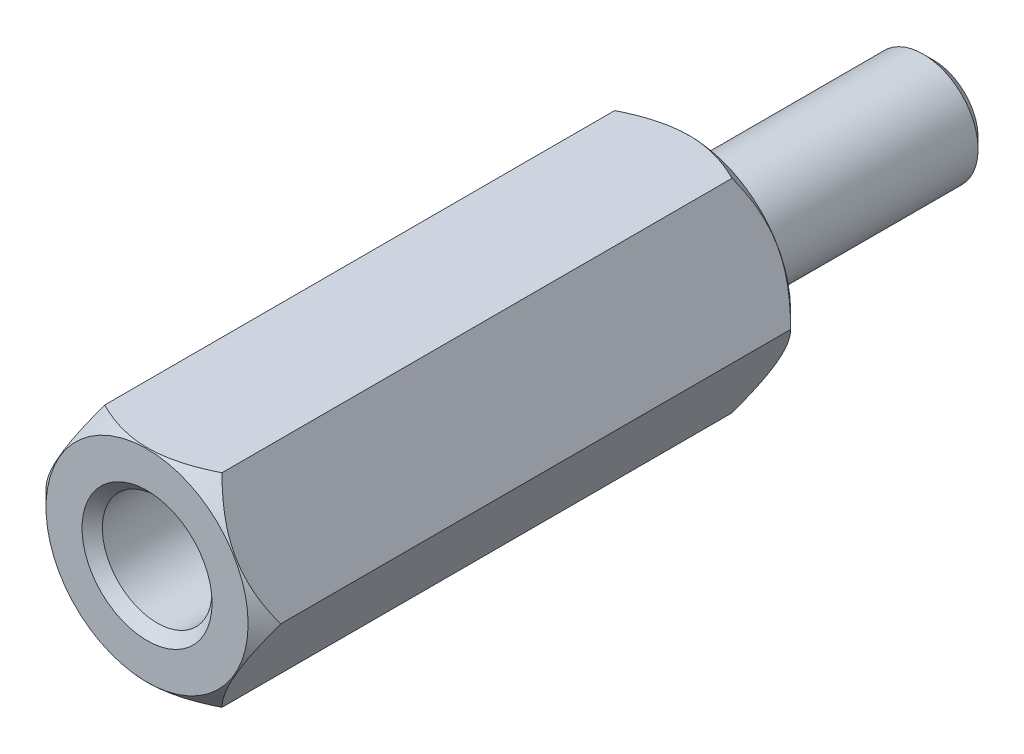
ISO-10303-21;
HEADER;
FILE_DESCRIPTION(('STEP AP214'),'2;1');
FILE_NAME('part.step','',(''),(''),'','','');
FILE_SCHEMA(('AUTOMOTIVE_DESIGN { 1 0 10303 214 1 1 1 1 }'));
ENDSEC;
DATA;
#1=APPLICATION_CONTEXT('core data for automotive mechanical design processes');
#2=APPLICATION_PROTOCOL_DEFINITION('international standard','automotive_design',2000,#1);
#3=PRODUCT_CONTEXT('',#1,'mechanical');
#4=PRODUCT('Part','Part','',(#3));
#5=PRODUCT_RELATED_PRODUCT_CATEGORY('part','',(#4));
#6=PRODUCT_DEFINITION_FORMATION('','',#4);
#7=PRODUCT_DEFINITION_CONTEXT('part definition',#1,'design');
#8=PRODUCT_DEFINITION('design','',#6,#7);
#9=PRODUCT_DEFINITION_SHAPE('','',#8);
#10=(LENGTH_UNIT() NAMED_UNIT(*) SI_UNIT(.MILLI.,.METRE.));
#11=(NAMED_UNIT(*) PLANE_ANGLE_UNIT() SI_UNIT($,.RADIAN.));
#12=(NAMED_UNIT(*) SI_UNIT($,.STERADIAN.) SOLID_ANGLE_UNIT());
#13=UNCERTAINTY_MEASURE_WITH_UNIT(LENGTH_MEASURE(1.E-05),#10,'distance_accuracy_value','');
#14=(GEOMETRIC_REPRESENTATION_CONTEXT(3) GLOBAL_UNCERTAINTY_ASSIGNED_CONTEXT((#13)) GLOBAL_UNIT_ASSIGNED_CONTEXT((#10,
#11,#12)) REPRESENTATION_CONTEXT('',''));
#15=CARTESIAN_POINT('',(0.,0.,0.));
#16=DIRECTION('',(0.,0.,1.));
#17=DIRECTION('',(1.,0.,0.));
#18=AXIS2_PLACEMENT_3D('',#15,#16,#17);
#19=CARTESIAN_POINT('',(0.,0.,6.675));
#20=DIRECTION('',(0.,0.,1.));
#21=DIRECTION('',(1.,0.,0.));
#22=AXIS2_PLACEMENT_3D('',#19,#20,#21);
#23=CYLINDRICAL_SURFACE('',#22,1.35);
#24=CARTESIAN_POINT('',(0.,0.,6.425));
#25=DIRECTION('',(0.,0.,1.));
#26=DIRECTION('',(1.,0.,0.));
#27=AXIS2_PLACEMENT_3D('',#24,#25,#26);
#28=CIRCLE('',#27,1.35);
#29=CARTESIAN_POINT('',(1.35,0.,6.425));
#30=VERTEX_POINT('',#29);
#31=EDGE_CURVE('E53',#30,#30,#28,.T.);
#32=ORIENTED_EDGE('',*,*,#31,.T.);
#33=EDGE_LOOP('',(#32));
#34=FACE_BOUND('',#33,.T.);
#35=CARTESIAN_POINT('',(0.,0.,-4.675));
#36=DIRECTION('',(0.,0.,-1.));
#37=DIRECTION('',(-1.,0.,0.));
#38=AXIS2_PLACEMENT_3D('',#35,#36,#37);
#39=CIRCLE('',#38,1.35);
#40=CARTESIAN_POINT('',(-1.35,0.,-4.675));
#41=VERTEX_POINT('',#40);
#42=EDGE_CURVE('E120',#41,#41,#39,.F.);
#43=ORIENTED_EDGE('',*,*,#42,.F.);
#44=EDGE_LOOP('',(#43));
#45=FACE_BOUND('',#44,.T.);
#46=ADVANCED_FACE('F43',(#34,#45),#23,.F.);
#47=CARTESIAN_POINT('',(1.44337567297409,-2.49999999999998,6.675));
#48=DIRECTION('',(-0.866025403784442,0.499999999999995,0.));
#49=DIRECTION('',(-0.499999999999995,-0.866025403784442,0.));
#50=AXIS2_PLACEMENT_3D('',#47,#48,#49);
#51=PLANE('',#50);
#52=CARTESIAN_POINT('',(1.44326020292026,-2.50019999999998,6.27488452301824));
#53=CARTESIAN_POINT('',(1.49287669073471,-2.41426172221222,6.32445929464527));
#54=CARTESIAN_POINT('',(1.54332283764112,-2.32688643272423,6.37112251863749));
#55=CARTESIAN_POINT('',(1.64618811625262,-2.1487185438344,6.4565618599617));
#56=CARTESIAN_POINT('',(1.69861703122362,-2.05790899931891,6.49529043759399));
#57=CARTESIAN_POINT('',(1.80433744175988,-1.87479587687307,6.56163329610226));
#58=CARTESIAN_POINT('',(1.85760201171318,-1.78253893547065,6.58941433146914));
#59=CARTESIAN_POINT('',(1.96530378549011,-1.59599399122371,6.63221682408933));
#60=CARTESIAN_POINT('',(2.01973769896308,-1.50171168743371,6.64727023332865));
#61=CARTESIAN_POINT('',(2.11355131286834,-1.33922174170815,6.66085227779051));
#62=CARTESIAN_POINT('',(2.15280980880343,-1.27122403211984,6.66286290075919));
#63=CARTESIAN_POINT('',(2.23126263056551,-1.13533975883078,6.6594758828125));
#64=CARTESIAN_POINT('',(2.27045692907359,-1.06745324244776,6.65407564470017));
#65=CARTESIAN_POINT('',(2.34847544336506,-0.932321211763889,6.63617421159752));
#66=CARTESIAN_POINT('',(2.38729919566124,-0.865076500246435,6.62366507295351));
#67=CARTESIAN_POINT('',(2.46427534467604,-0.731749899181796,6.59223249804429));
#68=CARTESIAN_POINT('',(2.50242779262543,-0.665667920900338,6.57330955350317));
#69=CARTESIAN_POINT('',(2.60015256308363,-0.496403653308731,6.51713263859175));
#70=CARTESIAN_POINT('',(2.65911894852989,-0.394270877777104,6.47564416840381));
#71=CARTESIAN_POINT('',(2.74582384890658,-0.244093585059489,6.40560595327691));
#72=CARTESIAN_POINT('',(2.77439698586412,-0.194603460117389,6.38099774788392));
#73=CARTESIAN_POINT('',(2.83101398781794,-0.096539936161153,6.32953811328476));
#74=CARTESIAN_POINT('',(2.85905816495513,-0.0479659965030722,6.30268806122064));
#75=CARTESIAN_POINT('',(2.88686681600197,0.000199999999999837,6.27488452301824));
#76=B_SPLINE_CURVE_WITH_KNOTS('',3,(#52,#53,#54,#55,#56,#57,#58,#59,#60,#61,#62,#63,#64,#65,#66,
#67,#68,#69,#70,#71,#72,#73,#74,#75),.UNSPECIFIED.,.F.,.F.,(4,2,2,2,2,2,2,2,2,2,2,4),(0.,
0.33301208513392,0.667964518301388,0.997597032043286,1.32639954393843,1.56169424147167,
1.79707142102081,2.03271213522169,2.26833478775648,2.64260240809531,2.82922877818861,
3.01574133749022),.UNSPECIFIED.);
#77=CARTESIAN_POINT('',(1.44337567297409,-2.49999999999998,6.275));
#78=VERTEX_POINT('',#77);
#79=CARTESIAN_POINT('',(2.88675134594813,0.,6.275));
#80=VERTEX_POINT('',#79);
#81=EDGE_CURVE('E97',#78,#80,#76,.T.);
#82=ORIENTED_EDGE('',*,*,#81,.F.);
#83=DIRECTION('',(0.,0.,-1.));
#84=VECTOR('',#83,1.);
#85=CARTESIAN_POINT('',(1.44337567297409,-2.49999999999998,6.675));
#86=LINE('',#85,#84);
#87=CARTESIAN_POINT('',(1.44337567297409,-2.49999999999998,-6.275));
#88=VERTEX_POINT('',#87);
#89=EDGE_CURVE('E68',#78,#88,#86,.T.);
#90=ORIENTED_EDGE('',*,*,#89,.T.);
#91=CARTESIAN_POINT('',(2.88686681600197,0.0002,-6.27488452301824));
#92=CARTESIAN_POINT('',(2.83725032818751,-0.0857382777877636,-6.32445929464527));
#93=CARTESIAN_POINT('',(2.7868041812811,-0.173113567275751,-6.37112251863749));
#94=CARTESIAN_POINT('',(2.68393890266961,-0.351281456165585,-6.4565618599617));
#95=CARTESIAN_POINT('',(2.63150998769861,-0.44209100068107,-6.49529043759399));
#96=CARTESIAN_POINT('',(2.52578957716235,-0.625204123126915,-6.56163329610226));
#97=CARTESIAN_POINT('',(2.47252500720905,-0.717461064529333,-6.58941433146914));
#98=CARTESIAN_POINT('',(2.36482323343211,-0.904006008776277,-6.63221682408933));
#99=CARTESIAN_POINT('',(2.31038931995914,-0.998288312566273,-6.64727023332865));
#100=CARTESIAN_POINT('',(2.21657570605388,-1.16077825829183,-6.66085227779051));
#101=CARTESIAN_POINT('',(2.1773172101188,-1.22877596788014,-6.66286290075919));
#102=CARTESIAN_POINT('',(2.09886438835672,-1.36466024116921,-6.6594758828125));
#103=CARTESIAN_POINT('',(2.05967008984864,-1.43254675755223,-6.65407564470017));
#104=CARTESIAN_POINT('',(1.98165157555717,-1.56767878823609,-6.63617421159752));
#105=CARTESIAN_POINT('',(1.94282782326099,-1.63492349975355,-6.62366507295351));
#106=CARTESIAN_POINT('',(1.86585167424618,-1.76825010081819,-6.59223249804429));
#107=CARTESIAN_POINT('',(1.8276992262968,-1.83433207909965,-6.57330955350317));
#108=CARTESIAN_POINT('',(1.7299744558386,-2.00359634669125,-6.51713263859175));
#109=CARTESIAN_POINT('',(1.67100807039233,-2.10572912222288,-6.47564416840381));
#110=CARTESIAN_POINT('',(1.58430317001565,-2.2559064149405,-6.40560595327691));
#111=CARTESIAN_POINT('',(1.5557300330581,-2.3053965398826,-6.38099774788392));
#112=CARTESIAN_POINT('',(1.49911303110429,-2.40346006383883,-6.32953811328476));
#113=CARTESIAN_POINT('',(1.47106885396709,-2.45203400349691,-6.30268806122064));
#114=CARTESIAN_POINT('',(1.44326020292026,-2.50019999999998,-6.27488452301824));
#115=B_SPLINE_CURVE_WITH_KNOTS('',3,(#91,#92,#93,#94,#95,#96,#97,#98,#99,#100,#101,#102,#103,
#104,#105,#106,#107,#108,#109,#110,#111,#112,#113,#114),.UNSPECIFIED.,.F.,.F.,(4,2,2,2,2,2,2,2,
2,2,2,4),(0.,0.333012085133919,0.667964518301387,0.997597032043285,1.32639954393842,
1.56169424147167,1.79707142102081,2.03271213522169,2.26833478775648,2.64260240809531,
2.82922877818861,3.01574133749022),.UNSPECIFIED.);
#116=CARTESIAN_POINT('',(2.88675134594813,0.,-6.275));
#117=VERTEX_POINT('',#116);
#118=EDGE_CURVE('E118',#117,#88,#115,.T.);
#119=ORIENTED_EDGE('',*,*,#118,.F.);
#120=DIRECTION('',(0.,0.,-1.));
#121=VECTOR('',#120,1.);
#122=CARTESIAN_POINT('',(2.88675134594813,0.,6.675));
#123=LINE('',#122,#121);
#124=EDGE_CURVE('E111',#80,#117,#123,.T.);
#125=ORIENTED_EDGE('',*,*,#124,.F.);
#126=EDGE_LOOP('',(#82,#90,#119,#125));
#127=FACE_BOUND('',#126,.T.);
#128=ADVANCED_FACE('F117',(#127),#51,.F.);
#129=CARTESIAN_POINT('',(2.88675134594813,0.,6.675));
#130=DIRECTION('',(-0.866025403784438,-0.500000000000001,0.));
#131=DIRECTION('',(0.500000000000001,-0.866025403784438,0.));
#132=AXIS2_PLACEMENT_3D('',#129,#130,#131);
#133=PLANE('',#132);
#134=CARTESIAN_POINT('',(2.88686681600197,-0.000200000000000087,6.27488452301824));
#135=CARTESIAN_POINT('',(2.83725032818751,0.0857382777877639,6.32445929464527));
#136=CARTESIAN_POINT('',(2.7868041812811,0.173113567275752,6.37112251863749));
#137=CARTESIAN_POINT('',(2.6839389026696,0.351281456165587,6.4565618599617));
#138=CARTESIAN_POINT('',(2.6315099876986,0.442091000681073,6.495290437594));
#139=CARTESIAN_POINT('',(2.52578957716234,0.625204123126919,6.56163329610226));
#140=CARTESIAN_POINT('',(2.47252500720904,0.717461064529338,6.58941433146914));
#141=CARTESIAN_POINT('',(2.3648232334321,0.904006008776283,6.63221682408934));
#142=CARTESIAN_POINT('',(2.31038931995913,0.99828831256628,6.64727023332866));
#143=CARTESIAN_POINT('',(2.21657570605387,1.16077825829184,6.66085227779052));
#144=CARTESIAN_POINT('',(2.17731721011878,1.22877596788015,6.6628629007592));
#145=CARTESIAN_POINT('',(2.0988643883567,1.36466024116921,6.65947588281251));
#146=CARTESIAN_POINT('',(2.05967008984862,1.43254675755223,6.65407564470018));
#147=CARTESIAN_POINT('',(1.98165157555715,1.5676787882361,6.63617421159753));
#148=CARTESIAN_POINT('',(1.94282782326097,1.63492349975355,6.62366507295352));
#149=CARTESIAN_POINT('',(1.86585167424616,1.76825010081819,6.5922324980443));
#150=CARTESIAN_POINT('',(1.82769922629678,1.83433207909965,6.57330955350319));
#151=CARTESIAN_POINT('',(1.72997445583858,2.00359634669126,6.51713263859176));
#152=CARTESIAN_POINT('',(1.67100807039231,2.10572912222289,6.47564416840382));
#153=CARTESIAN_POINT('',(1.58430317001562,2.25590641494051,6.40560595327691));
#154=CARTESIAN_POINT('',(1.55573003305807,2.30539653988261,6.38099774788393));
#155=CARTESIAN_POINT('',(1.49911303110425,2.40346006383885,6.32953811328476));
#156=CARTESIAN_POINT('',(1.47106885396706,2.45203400349693,6.30268806122064));
#157=CARTESIAN_POINT('',(1.44326020292022,2.50020000000001,6.27488452301823));
#158=B_SPLINE_CURVE_WITH_KNOTS('',3,(#134,#135,#136,#137,#138,#139,#140,#141,#142,#143,#144,
#145,#146,#147,#148,#149,#150,#151,#152,#153,#154,#155,#156,#157),.UNSPECIFIED.,.F.,.F.,(4,2,2,
2,2,2,2,2,2,2,2,4),(0.,0.333012085133924,0.667964518301396,0.997597032043298,1.32639954393844,
1.56169424147168,1.79707142102082,2.0327121352217,2.2683347877565,2.64260240809533,
2.82922877818864,3.01574133749026),.UNSPECIFIED.);
#159=CARTESIAN_POINT('',(1.44337567297406,2.50000000000001,6.275));
#160=VERTEX_POINT('',#159);
#161=EDGE_CURVE('E100',#80,#160,#158,.T.);
#162=ORIENTED_EDGE('',*,*,#161,.F.);
#163=ORIENTED_EDGE('',*,*,#124,.T.);
#164=CARTESIAN_POINT('',(1.44326020292022,2.50020000000001,-6.27488452301823));
#165=CARTESIAN_POINT('',(1.49287669073468,2.41426172221224,-6.32445929464527));
#166=CARTESIAN_POINT('',(1.54332283764109,2.32688643272425,-6.37112251863749));
#167=CARTESIAN_POINT('',(1.64618811625259,2.14871854383442,-6.4565618599617));
#168=CARTESIAN_POINT('',(1.69861703122359,2.05790899931893,-6.495290437594));
#169=CARTESIAN_POINT('',(1.80433744175985,1.87479587687309,-6.56163329610226));
#170=CARTESIAN_POINT('',(1.85760201171315,1.78253893547067,-6.58941433146915));
#171=CARTESIAN_POINT('',(1.96530378549009,1.59599399122372,-6.63221682408934));
#172=CARTESIAN_POINT('',(2.01973769896306,1.50171168743372,-6.64727023332866));
#173=CARTESIAN_POINT('',(2.11355131286832,1.33922174170816,-6.66085227779052));
#174=CARTESIAN_POINT('',(2.15280980880341,1.27122403211986,-6.6628629007592));
#175=CARTESIAN_POINT('',(2.23126263056549,1.13533975883079,-6.65947588281252));
#176=CARTESIAN_POINT('',(2.27045692907357,1.06745324244777,-6.65407564470018));
#177=CARTESIAN_POINT('',(2.34847544336504,0.932321211763906,-6.63617421159753));
#178=CARTESIAN_POINT('',(2.38729919566122,0.865076500246452,-6.62366507295352));
#179=CARTESIAN_POINT('',(2.46427534467603,0.731749899181814,-6.5922324980443));
#180=CARTESIAN_POINT('',(2.50242779262541,0.665667920900356,-6.57330955350319));
#181=CARTESIAN_POINT('',(2.60015256308361,0.496403653308746,-6.51713263859176));
#182=CARTESIAN_POINT('',(2.65911894852988,0.394270877777116,-6.47564416840382));
#183=CARTESIAN_POINT('',(2.74582384890657,0.244093585059497,-6.40560595327691));
#184=CARTESIAN_POINT('',(2.77439698586412,0.194603460117395,-6.38099774788393));
#185=CARTESIAN_POINT('',(2.83101398781794,0.0965399361611555,-6.32953811328476));
#186=CARTESIAN_POINT('',(2.85905816495513,0.0479659965030732,-6.30268806122064));
#187=CARTESIAN_POINT('',(2.88686681600197,-0.000200000000000132,-6.27488452301824));
#188=B_SPLINE_CURVE_WITH_KNOTS('',3,(#164,#165,#166,#167,#168,#169,#170,#171,#172,#173,#174,
#175,#176,#177,#178,#179,#180,#181,#182,#183,#184,#185,#186,#187),.UNSPECIFIED.,.F.,.F.,(4,2,2,
2,2,2,2,2,2,2,2,4),(0.,0.333012085133924,0.667964518301397,0.997597032043298,1.32639954393844,
1.56169424147168,1.79707142102082,2.0327121352217,2.2683347877565,2.64260240809533,
2.82922877818864,3.01574133749026),.UNSPECIFIED.);
#189=CARTESIAN_POINT('',(1.44337567297406,2.50000000000001,-6.275));
#190=VERTEX_POINT('',#189);
#191=EDGE_CURVE('E250',#190,#117,#188,.T.);
#192=ORIENTED_EDGE('',*,*,#191,.F.);
#193=DIRECTION('',(0.,0.,-1.));
#194=VECTOR('',#193,1.);
#195=CARTESIAN_POINT('',(1.44337567297406,2.50000000000001,6.675));
#196=LINE('',#195,#194);
#197=EDGE_CURVE('E113',#160,#190,#196,.T.);
#198=ORIENTED_EDGE('',*,*,#197,.F.);
#199=EDGE_LOOP('',(#162,#163,#192,#198));
#200=FACE_BOUND('',#199,.T.);
#201=ADVANCED_FACE('F109',(#200),#133,.F.);
#202=CARTESIAN_POINT('',(1.44337567297406,2.50000000000001,6.675));
#203=DIRECTION('',(0.,-1.,0.));
#204=DIRECTION('',(1.,0.,0.));
#205=AXIS2_PLACEMENT_3D('',#202,#203,#204);
#206=PLANE('',#205);
#207=CARTESIAN_POINT('',(4.35790807222665,2.50000000000002,4.13767304580408));
#208=CARTESIAN_POINT('',(4.22900505074815,2.50000000000001,4.24944020651167));
#209=CARTESIAN_POINT('',(4.09952897907173,2.50000000000001,4.36056009439582));
#210=CARTESIAN_POINT('',(3.83898638028681,2.50000000000001,4.58104374915113));
#211=CARTESIAN_POINT('',(3.70791912620545,2.50000000000001,4.69040665588042));
#212=CARTESIAN_POINT('',(3.44083760855068,2.50000000000001,4.9092940749196));
#213=CARTESIAN_POINT('',(3.30477887797079,2.50000000000001,5.01876454299068));
#214=CARTESIAN_POINT('',(3.03009587684347,2.50000000000001,5.23438263287971));
#215=CARTESIAN_POINT('',(2.89147225782007,2.50000000000001,5.34053108059659));
#216=CARTESIAN_POINT('',(2.61062429451693,2.50000000000001,5.54838578520496));
#217=CARTESIAN_POINT('',(2.46839537969834,2.50000000000001,5.65008590704004));
#218=CARTESIAN_POINT('',(2.1792548679078,2.50000000000001,5.84694970638111));
#219=CARTESIAN_POINT('',(2.03233957265132,2.50000000000001,5.94210802470616));
#220=CARTESIAN_POINT('',(1.73361597358269,2.50000000000001,6.12180833734887));
#221=CARTESIAN_POINT('',(1.58185407011246,2.50000000000001,6.20642645277549));
#222=CARTESIAN_POINT('',(1.27084130527911,2.5,6.36052599595445));
#223=CARTESIAN_POINT('',(1.11160488303033,2.5,6.43003525688872));
#224=CARTESIAN_POINT('',(0.864657376231813,2.5,6.51759642513527));
#225=CARTESIAN_POINT('',(0.779993026222529,2.5,6.54420046305057));
#226=CARTESIAN_POINT('',(0.608668935092183,2.5,6.59004582346072));
#227=CARTESIAN_POINT('',(0.522009514777902,2.5,6.60928832104285));
#228=CARTESIAN_POINT('',(0.347739556932347,2.5,6.6391318069513));
#229=CARTESIAN_POINT('',(0.260138222188833,2.5,6.64978552783328));
#230=CARTESIAN_POINT('',(0.0842961272603252,2.5,6.66186770307153));
#231=CARTESIAN_POINT('',(-0.00394456438843445,2.5,6.66329713200226));
#232=CARTESIAN_POINT('',(-0.180192018780202,2.5,6.65681608276146));
#233=CARTESIAN_POINT('',(-0.268198313940575,2.5,6.64889317264444));
#234=CARTESIAN_POINT('',(-0.442968473014166,2.5,6.62428693602144));
#235=CARTESIAN_POINT('',(-0.529732088460496,2.5,6.60760188201526));
#236=CARTESIAN_POINT('',(-0.702003641636127,2.5,6.56641807606219));
#237=CARTESIAN_POINT('',(-0.787498274243344,2.5,6.54186463906262));
#238=CARTESIAN_POINT('',(-0.956318998116774,2.5,6.48627227919823));
#239=CARTESIAN_POINT('',(-1.03964506444262,2.5,6.45523328178096));
#240=CARTESIAN_POINT('',(-1.22260914379835,2.5,6.3803275261388));
#241=CARTESIAN_POINT('',(-1.32170415747564,2.5,6.33514559308748));
#242=CARTESIAN_POINT('',(-1.51694385371059,2.49999999999999,6.23875515379207));
#243=CARTESIAN_POINT('',(-1.61308679170485,2.49999999999999,6.18754316726495));
#244=CARTESIAN_POINT('',(-1.80296614219628,2.49999999999999,6.08043166741102));
#245=CARTESIAN_POINT('',(-1.89669715950606,2.49999999999999,6.02452266760246));
#246=CARTESIAN_POINT('',(-2.08192800240938,2.49999999999999,5.90918674307867));
#247=CARTESIAN_POINT('',(-2.17342826625812,2.49999999999999,5.84976051735269));
#248=CARTESIAN_POINT('',(-2.35505847652759,2.49999999999999,5.72784030367594));
#249=CARTESIAN_POINT('',(-2.445178569973,2.49999999999999,5.66533170499247));
#250=CARTESIAN_POINT('',(-2.62385919422445,2.49999999999999,5.53811875000849));
#251=CARTESIAN_POINT('',(-2.71241960671451,2.49999999999999,5.47341422820777));
#252=CARTESIAN_POINT('',(-2.97593968609531,2.49999999999999,5.27684992046114));
#253=CARTESIAN_POINT('',(-3.14895696314838,2.49999999999999,5.14238929484152));
#254=CARTESIAN_POINT('',(-3.49727644035013,2.49999999999999,4.8641181670107));
#255=CARTESIAN_POINT('',(-3.67244750970817,2.49999999999999,4.72014512901895));
#256=CARTESIAN_POINT('',(-3.93212110001528,2.49999999999999,4.50241624538674));
#257=CARTESIAN_POINT('',(-4.01770626505474,2.49999999999999,4.42994531232854));
#258=CARTESIAN_POINT('',(-4.1882495214834,2.49999999999999,4.28430608888148));
#259=CARTESIAN_POINT('',(-4.27320774421479,2.49999999999999,4.21113795236392));
#260=CARTESIAN_POINT('',(-4.35790807222667,2.49999999999999,4.13767304580408));
#261=B_SPLINE_CURVE_WITH_KNOTS('',3,(#207,#208,#209,#210,#211,#212,#213,#214,#215,#216,#217,
#218,#219,#220,#221,#222,#223,#224,#225,#226,#227,#228,#229,#230,#231,#232,#233,#234,#235,#236,
#237,#238,#239,#240,#241,#242,#243,#244,#245,#246,#247,#248,#249,#250,#251,#252,#253,#254,#255,
#256,#257,#258,#259,#260),.UNSPECIFIED.,.F.,.F.,(4,2,2,2,2,2,2,2,2,2,2,2,2,2,2,2,2,2,2,2,2,2,2,
2,2,2,4),(0.,0.511842212813335,1.02392780167291,1.54778169920521,2.07150430797679,
2.59592780979256,3.12077593308527,3.6415817306556,4.16141982425733,4.42739176689035,
4.69332123596951,4.95760526901694,5.22186137919604,5.48646915760419,5.75112912434678,
6.01766988465733,6.28421370906122,6.61066447125654,6.93730457870704,7.26462103112127,
7.59187265192314,7.92086150920109,8.24987521669912,8.90710736338419,9.5872861612455,
9.92372274140156,10.2600867154781),.UNSPECIFIED.);
#262=CARTESIAN_POINT('',(-1.44337567297408,2.49999999999999,6.275));
#263=VERTEX_POINT('',#262);
#264=EDGE_CURVE('E115',#160,#263,#261,.T.);
#265=ORIENTED_EDGE('',*,*,#264,.F.);
#266=ORIENTED_EDGE('',*,*,#197,.T.);
#267=CARTESIAN_POINT('',(-4.35790807222667,2.49999999999999,-4.13767304580408));
#268=CARTESIAN_POINT('',(-4.22900505074817,2.49999999999999,-4.24944020651167));
#269=CARTESIAN_POINT('',(-4.09952897907174,2.49999999999999,-4.36056009439582));
#270=CARTESIAN_POINT('',(-3.83898638028683,2.49999999999999,-4.58104374915113));
#271=CARTESIAN_POINT('',(-3.70791912620547,2.49999999999999,-4.69040665588042));
#272=CARTESIAN_POINT('',(-3.44083760855069,2.49999999999999,-4.9092940749196));
#273=CARTESIAN_POINT('',(-3.30477887797081,2.49999999999999,-5.01876454299068));
#274=CARTESIAN_POINT('',(-3.03009587684349,2.49999999999999,-5.23438263287971));
#275=CARTESIAN_POINT('',(-2.89147225782009,2.49999999999999,-5.34053108059659));
#276=CARTESIAN_POINT('',(-2.61062429451694,2.49999999999999,-5.54838578520496));
#277=CARTESIAN_POINT('',(-2.46839537969836,2.49999999999999,-5.65008590704004));
#278=CARTESIAN_POINT('',(-2.17925486790782,2.49999999999999,-5.84694970638111));
#279=CARTESIAN_POINT('',(-2.03233957265134,2.49999999999999,-5.94210802470616));
#280=CARTESIAN_POINT('',(-1.73361597358271,2.49999999999999,-6.12180833734887));
#281=CARTESIAN_POINT('',(-1.58185407011248,2.49999999999999,-6.20642645277549));
#282=CARTESIAN_POINT('',(-1.27084130527913,2.5,-6.36052599595445));
#283=CARTESIAN_POINT('',(-1.11160488303034,2.5,-6.43003525688872));
#284=CARTESIAN_POINT('',(-0.864657376231832,2.5,-6.51759642513527));
#285=CARTESIAN_POINT('',(-0.779993026222548,2.5,-6.54420046305057));
#286=CARTESIAN_POINT('',(-0.608668935092201,2.5,-6.59004582346072));
#287=CARTESIAN_POINT('',(-0.522009514777921,2.5,-6.60928832104285));
#288=CARTESIAN_POINT('',(-0.347739556932365,2.5,-6.6391318069513));
#289=CARTESIAN_POINT('',(-0.260138222188852,2.5,-6.64978552783328));
#290=CARTESIAN_POINT('',(-0.0842961272603439,2.5,-6.66186770307153));
#291=CARTESIAN_POINT('',(0.00394456438841563,2.5,-6.66329713200226));
#292=CARTESIAN_POINT('',(0.180192018780183,2.5,-6.65681608276146));
#293=CARTESIAN_POINT('',(0.268198313940556,2.5,-6.64889317264444));
#294=CARTESIAN_POINT('',(0.442968473014147,2.5,-6.62428693602144));
#295=CARTESIAN_POINT('',(0.529732088460477,2.5,-6.60760188201526));
#296=CARTESIAN_POINT('',(0.702003641636109,2.5,-6.56641807606219));
#297=CARTESIAN_POINT('',(0.787498274243325,2.5,-6.54186463906262));
#298=CARTESIAN_POINT('',(0.956318998116755,2.5,-6.48627227919823));
#299=CARTESIAN_POINT('',(1.0396450644426,2.5,-6.45523328178096));
#300=CARTESIAN_POINT('',(1.22260914379833,2.5,-6.3803275261388));
#301=CARTESIAN_POINT('',(1.32170415747562,2.5,-6.33514559308748));
#302=CARTESIAN_POINT('',(1.51694385371057,2.50000000000001,-6.23875515379208));
#303=CARTESIAN_POINT('',(1.61308679170483,2.50000000000001,-6.18754316726496));
#304=CARTESIAN_POINT('',(1.80296614219626,2.50000000000001,-6.08043166741102));
#305=CARTESIAN_POINT('',(1.89669715950604,2.50000000000001,-6.02452266760246));
#306=CARTESIAN_POINT('',(2.08192800240936,2.50000000000001,-5.90918674307867));
#307=CARTESIAN_POINT('',(2.1734282662581,2.50000000000001,-5.84976051735269));
#308=CARTESIAN_POINT('',(2.35505847652756,2.50000000000001,-5.72784030367594));
#309=CARTESIAN_POINT('',(2.44517856997298,2.50000000000001,-5.66533170499247));
#310=CARTESIAN_POINT('',(2.62385919422443,2.50000000000001,-5.5381187500085));
#311=CARTESIAN_POINT('',(2.71241960671449,2.50000000000001,-5.47341422820778));
#312=CARTESIAN_POINT('',(2.97593968609528,2.50000000000001,-5.27684992046114));
#313=CARTESIAN_POINT('',(3.14895696314835,2.50000000000001,-5.14238929484152));
#314=CARTESIAN_POINT('',(3.4972764403501,2.50000000000001,-4.86411816701071));
#315=CARTESIAN_POINT('',(3.67244750970814,2.50000000000001,-4.72014512901895));
#316=CARTESIAN_POINT('',(3.93212110001526,2.50000000000001,-4.50241624538674));
#317=CARTESIAN_POINT('',(4.01770626505473,2.50000000000001,-4.42994531232854));
#318=CARTESIAN_POINT('',(4.18824952148338,2.50000000000001,-4.28430608888148));
#319=CARTESIAN_POINT('',(4.27320774421478,2.50000000000001,-4.21113795236392));
#320=CARTESIAN_POINT('',(4.35790807222665,2.50000000000002,-4.13767304580408));
#321=B_SPLINE_CURVE_WITH_KNOTS('',3,(#267,#268,#269,#270,#271,#272,#273,#274,#275,#276,#277,
#278,#279,#280,#281,#282,#283,#284,#285,#286,#287,#288,#289,#290,#291,#292,#293,#294,#295,#296,
#297,#298,#299,#300,#301,#302,#303,#304,#305,#306,#307,#308,#309,#310,#311,#312,#313,#314,#315,
#316,#317,#318,#319,#320),.UNSPECIFIED.,.F.,.F.,(4,2,2,2,2,2,2,2,2,2,2,2,2,2,2,2,2,2,2,2,2,2,2,
2,2,2,4),(0.,0.511842212813336,1.02392780167291,1.54778169920521,2.07150430797679,
2.59592780979256,3.12077593308527,3.6415817306556,4.16141982425733,4.42739176689035,
4.69332123596951,4.95760526901694,5.22186137919604,5.48646915760419,5.75112912434678,
6.01766988465733,6.28421370906122,6.61066447125654,6.93730457870704,7.26462103112127,
7.59187265192314,7.92086150920109,8.24987521669911,8.90710736338418,9.5872861612455,
9.92372274140157,10.2600867154781),.UNSPECIFIED.);
#322=CARTESIAN_POINT('',(-1.44337567297408,2.49999999999999,-6.275));
#323=VERTEX_POINT('',#322);
#324=EDGE_CURVE('E258',#323,#190,#321,.T.);
#325=ORIENTED_EDGE('',*,*,#324,.F.);
#326=DIRECTION('',(0.,0.,-1.));
#327=VECTOR('',#326,1.);
#328=CARTESIAN_POINT('',(-1.44337567297408,2.5,6.675));
#329=LINE('',#328,#327);
#330=EDGE_CURVE('E127',#263,#323,#329,.T.);
#331=ORIENTED_EDGE('',*,*,#330,.F.);
#332=EDGE_LOOP('',(#265,#266,#325,#331));
#333=FACE_BOUND('',#332,.T.);
#334=ADVANCED_FACE('F244',(#333),#206,.F.);
#335=CARTESIAN_POINT('',(-1.44337567297408,2.5,6.675));
#336=DIRECTION('',(0.866025403784442,-0.499999999999995,0.));
#337=DIRECTION('',(0.499999999999995,0.866025403784442,0.));
#338=AXIS2_PLACEMENT_3D('',#335,#336,#337);
#339=PLANE('',#338);
#340=CARTESIAN_POINT('',(-1.44326020292024,2.5002,6.27488452301823));
#341=CARTESIAN_POINT('',(-1.4928766907347,2.41426172221223,6.32445929464527));
#342=CARTESIAN_POINT('',(-1.54332283764111,2.32688643272424,6.37112251863749));
#343=CARTESIAN_POINT('',(-1.6461881162526,2.14871854383441,6.4565618599617));
#344=CARTESIAN_POINT('',(-1.6986170312236,2.05790899931892,6.495290437594));
#345=CARTESIAN_POINT('',(-1.80433744175986,1.87479587687307,6.56163329610226));
#346=CARTESIAN_POINT('',(-1.85760201171316,1.78253893547065,6.58941433146915));
#347=CARTESIAN_POINT('',(-1.9653037854901,1.59599399122371,6.63221682408934));
#348=CARTESIAN_POINT('',(-2.01973769896307,1.50171168743371,6.64727023332866));
#349=CARTESIAN_POINT('',(-2.11355131286833,1.33922174170815,6.66085227779052));
#350=CARTESIAN_POINT('',(-2.15280980880342,1.27122403211984,6.6628629007592));
#351=CARTESIAN_POINT('',(-2.2312626305655,1.13533975883077,6.65947588281251));
#352=CARTESIAN_POINT('',(-2.27045692907358,1.06745324244776,6.65407564470018));
#353=CARTESIAN_POINT('',(-2.34847544336505,0.932321211763888,6.63617421159753));
#354=CARTESIAN_POINT('',(-2.38729919566123,0.865076500246434,6.62366507295352));
#355=CARTESIAN_POINT('',(-2.46427534467603,0.731749899181796,6.5922324980443));
#356=CARTESIAN_POINT('',(-2.50242779262542,0.665667920900338,6.57330955350319));
#357=CARTESIAN_POINT('',(-2.60015256308362,0.496403653308727,6.51713263859176));
#358=CARTESIAN_POINT('',(-2.65911894852989,0.394270877777097,6.47564416840382));
#359=CARTESIAN_POINT('',(-2.74582384890657,0.244093585059477,6.40560595327691));
#360=CARTESIAN_POINT('',(-2.77439698586412,0.194603460117375,6.38099774788393));
#361=CARTESIAN_POINT('',(-2.83101398781794,0.0965399361611354,6.32953811328477));
#362=CARTESIAN_POINT('',(-2.85905816495513,0.0479659965030531,6.30268806122064));
#363=CARTESIAN_POINT('',(-2.88686681600197,-0.000200000000020073,6.27488452301824));
#364=B_SPLINE_CURVE_WITH_KNOTS('',3,(#340,#341,#342,#343,#344,#345,#346,#347,#348,#349,#350,
#351,#352,#353,#354,#355,#356,#357,#358,#359,#360,#361,#362,#363),.UNSPECIFIED.,.F.,.F.,(4,2,2,
2,2,2,2,2,2,2,2,4),(0.,0.333012085133924,0.667964518301397,0.997597032043299,1.32639954393844,
1.56169424147168,1.79707142102083,2.0327121352217,2.2683347877565,2.64260240809533,
2.82922877818864,3.01574133749026),.UNSPECIFIED.);
#365=CARTESIAN_POINT('',(-2.88675134594813,0.,6.275));
#366=VERTEX_POINT('',#365);
#367=EDGE_CURVE('E222',#263,#366,#364,.T.);
#368=ORIENTED_EDGE('',*,*,#367,.F.);
#369=ORIENTED_EDGE('',*,*,#330,.T.);
#370=CARTESIAN_POINT('',(-2.88686681600197,-0.000200000000020158,-6.27488452301824));
#371=CARTESIAN_POINT('',(-2.83725032818751,0.085738277787745,-6.32445929464527));
#372=CARTESIAN_POINT('',(-2.7868041812811,0.173113567275734,-6.37112251863749));
#373=CARTESIAN_POINT('',(-2.68393890266961,0.351281456165569,-6.4565618599617));
#374=CARTESIAN_POINT('',(-2.6315099876986,0.442091000681056,-6.495290437594));
#375=CARTESIAN_POINT('',(-2.52578957716234,0.625204123126902,-6.56163329610226));
#376=CARTESIAN_POINT('',(-2.47252500720905,0.717461064529322,-6.58941433146915));
#377=CARTESIAN_POINT('',(-2.36482323343211,0.904006008776268,-6.63221682408934));
#378=CARTESIAN_POINT('',(-2.31038931995914,0.998288312566265,-6.64727023332866));
#379=CARTESIAN_POINT('',(-2.21657570605388,1.16077825829183,-6.66085227779052));
#380=CARTESIAN_POINT('',(-2.17731721011879,1.22877596788013,-6.6628629007592));
#381=CARTESIAN_POINT('',(-2.09886438835671,1.3646602411692,-6.65947588281251));
#382=CARTESIAN_POINT('',(-2.05967008984863,1.43254675755222,-6.65407564470018));
#383=CARTESIAN_POINT('',(-1.98165157555716,1.56767878823609,-6.63617421159753));
#384=CARTESIAN_POINT('',(-1.94282782326098,1.63492349975354,-6.62366507295352));
#385=CARTESIAN_POINT('',(-1.86585167424617,1.76825010081818,-6.5922324980443));
#386=CARTESIAN_POINT('',(-1.82769922629679,1.83433207909964,-6.57330955350319));
#387=CARTESIAN_POINT('',(-1.72997445583859,2.00359634669125,-6.51713263859176));
#388=CARTESIAN_POINT('',(-1.67100807039232,2.10572912222288,-6.47564416840382));
#389=CARTESIAN_POINT('',(-1.58430317001564,2.2559064149405,-6.40560595327691));
#390=CARTESIAN_POINT('',(-1.55573003305809,2.3053965398826,-6.38099774788393));
#391=CARTESIAN_POINT('',(-1.49911303110427,2.40346006383884,-6.32953811328476));
#392=CARTESIAN_POINT('',(-1.47106885396707,2.45203400349692,-6.30268806122064));
#393=CARTESIAN_POINT('',(-1.44326020292024,2.5002,-6.27488452301823));
#394=B_SPLINE_CURVE_WITH_KNOTS('',3,(#370,#371,#372,#373,#374,#375,#376,#377,#378,#379,#380,
#381,#382,#383,#384,#385,#386,#387,#388,#389,#390,#391,#392,#393),.UNSPECIFIED.,.F.,.F.,(4,2,2,
2,2,2,2,2,2,2,2,4),(0.,0.333012085133925,0.667964518301397,0.997597032043299,1.32639954393844,
1.56169424147168,1.79707142102082,2.0327121352217,2.2683347877565,2.64260240809533,
2.82922877818864,3.01574133749026),.UNSPECIFIED.);
#395=CARTESIAN_POINT('',(-2.88675134594813,0.,-6.275));
#396=VERTEX_POINT('',#395);
#397=EDGE_CURVE('E285',#396,#323,#394,.T.);
#398=ORIENTED_EDGE('',*,*,#397,.F.);
#399=DIRECTION('',(0.,0.,-1.));
#400=VECTOR('',#399,1.);
#401=CARTESIAN_POINT('',(-2.88675134594813,0.,6.675));
#402=LINE('',#401,#400);
#403=EDGE_CURVE('E275',#366,#396,#402,.T.);
#404=ORIENTED_EDGE('',*,*,#403,.F.);
#405=EDGE_LOOP('',(#368,#369,#398,#404));
#406=FACE_BOUND('',#405,.T.);
#407=ADVANCED_FACE('F283',(#406),#339,.F.);
#408=CARTESIAN_POINT('',(-2.88675134594813,0.,6.675));
#409=DIRECTION('',(0.866025403784435,0.500000000000007,0.));
#410=DIRECTION('',(-0.500000000000007,0.866025403784435,0.));
#411=AXIS2_PLACEMENT_3D('',#408,#409,#410);
#412=PLANE('',#411);
#413=CARTESIAN_POINT('',(-2.88686681600197,0.000199999999979928,6.27488452301824));
#414=CARTESIAN_POINT('',(-2.83725032818751,-0.0857382777877844,6.32445929464527));
#415=CARTESIAN_POINT('',(-2.7868041812811,-0.173113567275773,6.37112251863749));
#416=CARTESIAN_POINT('',(-2.6839389026696,-0.351281456165607,6.4565618599617));
#417=CARTESIAN_POINT('',(-2.6315099876986,-0.442091000681093,6.495290437594));
#418=CARTESIAN_POINT('',(-2.52578957716233,-0.625204123126938,6.56163329610226));
#419=CARTESIAN_POINT('',(-2.47252500720903,-0.717461064529357,6.58941433146915));
#420=CARTESIAN_POINT('',(-2.3648232334321,-0.904006008776302,6.63221682408934));
#421=CARTESIAN_POINT('',(-2.31038931995912,-0.998288312566299,6.64727023332866));
#422=CARTESIAN_POINT('',(-2.21657570605386,-1.16077825829186,6.66085227779052));
#423=CARTESIAN_POINT('',(-2.17731721011877,-1.22877596788016,6.6628629007592));
#424=CARTESIAN_POINT('',(-2.09886438835669,-1.36466024116923,6.65947588281251));
#425=CARTESIAN_POINT('',(-2.05967008984861,-1.43254675755225,6.65407564470018));
#426=CARTESIAN_POINT('',(-1.98165157555714,-1.56767878823612,6.63617421159753));
#427=CARTESIAN_POINT('',(-1.94282782326096,-1.63492349975357,6.62366507295352));
#428=CARTESIAN_POINT('',(-1.86585167424615,-1.76825010081821,6.5922324980443));
#429=CARTESIAN_POINT('',(-1.82769922629677,-1.83433207909966,6.57330955350319));
#430=CARTESIAN_POINT('',(-1.72997445583856,-2.00359634669127,6.51713263859176));
#431=CARTESIAN_POINT('',(-1.67100807039229,-2.1057291222229,6.47564416840382));
#432=CARTESIAN_POINT('',(-1.5843031700156,-2.25590641494052,6.40560595327691));
#433=CARTESIAN_POINT('',(-1.55573003305805,-2.30539653988262,6.38099774788393));
#434=CARTESIAN_POINT('',(-1.49911303110423,-2.40346006383886,6.32953811328476));
#435=CARTESIAN_POINT('',(-1.47106885396704,-2.45203400349694,6.30268806122064));
#436=CARTESIAN_POINT('',(-1.4432602029202,-2.50020000000002,6.27488452301824));
#437=B_SPLINE_CURVE_WITH_KNOTS('',3,(#413,#414,#415,#416,#417,#418,#419,#420,#421,#422,#423,
#424,#425,#426,#427,#428,#429,#430,#431,#432,#433,#434,#435,#436),.UNSPECIFIED.,.F.,.F.,(4,2,2,
2,2,2,2,2,2,2,2,4),(0.,0.333012085133925,0.667964518301398,0.9975970320433,1.32639954393844,
1.56169424147169,1.79707142102083,2.0327121352217,2.2683347877565,2.64260240809533,
2.82922877818864,3.01574133749026),.UNSPECIFIED.);
#438=CARTESIAN_POINT('',(-1.44337567297404,-2.50000000000001,6.275));
#439=VERTEX_POINT('',#438);
#440=EDGE_CURVE('E60',#366,#439,#437,.T.);
#441=ORIENTED_EDGE('',*,*,#440,.F.);
#442=ORIENTED_EDGE('',*,*,#403,.T.);
#443=CARTESIAN_POINT('',(-1.4432602029202,-2.50020000000002,-6.27488452301824));
#444=CARTESIAN_POINT('',(-1.49287669073466,-2.41426172221225,-6.32445929464527));
#445=CARTESIAN_POINT('',(-1.54332283764108,-2.32688643272426,-6.37112251863749));
#446=CARTESIAN_POINT('',(-1.64618811625257,-2.14871854383443,-6.4565618599617));
#447=CARTESIAN_POINT('',(-1.69861703122357,-2.05790899931894,-6.495290437594));
#448=CARTESIAN_POINT('',(-1.80433744175984,-1.8747958768731,-6.56163329610226));
#449=CARTESIAN_POINT('',(-1.85760201171314,-1.78253893547068,-6.58941433146915));
#450=CARTESIAN_POINT('',(-1.96530378549008,-1.59599399122374,-6.63221682408934));
#451=CARTESIAN_POINT('',(-2.01973769896305,-1.50171168743374,-6.64727023332866));
#452=CARTESIAN_POINT('',(-2.11355131286831,-1.33922174170818,-6.66085227779052));
#453=CARTESIAN_POINT('',(-2.1528098088034,-1.27122403211987,-6.6628629007592));
#454=CARTESIAN_POINT('',(-2.23126263056548,-1.13533975883081,-6.65947588281251));
#455=CARTESIAN_POINT('',(-2.27045692907356,-1.06745324244779,-6.65407564470018));
#456=CARTESIAN_POINT('',(-2.34847544336503,-0.932321211763922,-6.63617421159753));
#457=CARTESIAN_POINT('',(-2.38729919566122,-0.865076500246468,-6.62366507295352));
#458=CARTESIAN_POINT('',(-2.46427534467602,-0.731749899181831,-6.5922324980443));
#459=CARTESIAN_POINT('',(-2.50242779262541,-0.665667920900374,-6.57330955350319));
#460=CARTESIAN_POINT('',(-2.60015256308361,-0.496403653308765,-6.51713263859176));
#461=CARTESIAN_POINT('',(-2.65911894852988,-0.394270877777135,-6.47564416840382));
#462=CARTESIAN_POINT('',(-2.74582384890657,-0.244093585059517,-6.40560595327691));
#463=CARTESIAN_POINT('',(-2.77439698586412,-0.194603460117415,-6.38099774788393));
#464=CARTESIAN_POINT('',(-2.83101398781794,-0.0965399361611758,-6.32953811328476));
#465=CARTESIAN_POINT('',(-2.85905816495513,-0.0479659965030938,-6.30268806122064));
#466=CARTESIAN_POINT('',(-2.88686681600197,0.000199999999979455,-6.27488452301824));
#467=B_SPLINE_CURVE_WITH_KNOTS('',3,(#443,#444,#445,#446,#447,#448,#449,#450,#451,#452,#453,
#454,#455,#456,#457,#458,#459,#460,#461,#462,#463,#464,#465,#466),.UNSPECIFIED.,.F.,.F.,(4,2,2,
2,2,2,2,2,2,2,2,4),(0.,0.333012085133923,0.667964518301396,0.997597032043298,1.32639954393844,
1.56169424147168,1.79707142102082,2.0327121352217,2.2683347877565,2.64260240809533,
2.82922877818864,3.01574133749026),.UNSPECIFIED.);
#468=CARTESIAN_POINT('',(-1.44337567297404,-2.50000000000002,-6.275));
#469=VERTEX_POINT('',#468);
#470=EDGE_CURVE('E293',#469,#396,#467,.T.);
#471=ORIENTED_EDGE('',*,*,#470,.F.);
#472=DIRECTION('',(0.,0.,-1.));
#473=VECTOR('',#472,1.);
#474=CARTESIAN_POINT('',(-1.44337567297404,-2.50000000000001,6.675));
#475=LINE('',#474,#473);
#476=EDGE_CURVE('E272',#439,#469,#475,.T.);
#477=ORIENTED_EDGE('',*,*,#476,.F.);
#478=EDGE_LOOP('',(#441,#442,#471,#477));
#479=FACE_BOUND('',#478,.T.);
#480=ADVANCED_FACE('F183',(#479),#412,.F.);
#481=CARTESIAN_POINT('',(-1.44337567297404,-2.50000000000001,6.675));
#482=DIRECTION('',(0.,1.,0.));
#483=DIRECTION('',(-1.,0.,0.));
#484=AXIS2_PLACEMENT_3D('',#481,#482,#483);
#485=PLANE('',#484);
#486=CARTESIAN_POINT('',(-4.35790807222664,-2.50000000000005,4.13767304580408));
#487=CARTESIAN_POINT('',(-4.22900505074813,-2.50000000000004,4.24944020651167));
#488=CARTESIAN_POINT('',(-4.09952897907171,-2.50000000000004,4.36056009439582));
#489=CARTESIAN_POINT('',(-3.83898638028679,-2.50000000000004,4.58104374915113));
#490=CARTESIAN_POINT('',(-3.70791912620543,-2.50000000000004,4.69040665588042));
#491=CARTESIAN_POINT('',(-3.44083760855066,-2.50000000000004,4.9092940749196));
#492=CARTESIAN_POINT('',(-3.30477887797077,-2.50000000000003,5.01876454299068));
#493=CARTESIAN_POINT('',(-3.03009587684346,-2.50000000000003,5.23438263287971));
#494=CARTESIAN_POINT('',(-2.89147225782005,-2.50000000000003,5.34053108059659));
#495=CARTESIAN_POINT('',(-2.61062429451691,-2.50000000000003,5.54838578520496));
#496=CARTESIAN_POINT('',(-2.46839537969832,-2.50000000000003,5.65008590704004));
#497=CARTESIAN_POINT('',(-2.17925486790778,-2.50000000000002,5.84694970638111));
#498=CARTESIAN_POINT('',(-2.0323395726513,-2.50000000000002,5.94210802470616));
#499=CARTESIAN_POINT('',(-1.73361597358267,-2.50000000000002,6.12180833734887));
#500=CARTESIAN_POINT('',(-1.58185407011245,-2.50000000000002,6.20642645277549));
#501=CARTESIAN_POINT('',(-1.2708413052791,-2.50000000000001,6.36052599595445));
#502=CARTESIAN_POINT('',(-1.11160488303031,-2.50000000000001,6.43003525688872));
#503=CARTESIAN_POINT('',(-0.864657376231797,-2.50000000000001,6.51759642513527));
#504=CARTESIAN_POINT('',(-0.779993026222513,-2.50000000000001,6.54420046305057));
#505=CARTESIAN_POINT('',(-0.608668935092166,-2.50000000000001,6.59004582346072));
#506=CARTESIAN_POINT('',(-0.522009514777885,-2.50000000000001,6.60928832104285));
#507=CARTESIAN_POINT('',(-0.34773955693233,-2.5,6.6391318069513));
#508=CARTESIAN_POINT('',(-0.260138222188816,-2.5,6.64978552783328));
#509=CARTESIAN_POINT('',(-0.0842961272603083,-2.5,6.66186770307153));
#510=CARTESIAN_POINT('',(0.00394456438845115,-2.5,6.66329713200227));
#511=CARTESIAN_POINT('',(0.180192018780218,-2.5,6.65681608276146));
#512=CARTESIAN_POINT('',(0.268198313940591,-2.5,6.64889317264444));
#513=CARTESIAN_POINT('',(0.442968473014182,-2.5,6.62428693602144));
#514=CARTESIAN_POINT('',(0.529732088460513,-2.49999999999999,6.60760188201526));
#515=CARTESIAN_POINT('',(0.702003641636144,-2.49999999999999,6.56641807606219));
#516=CARTESIAN_POINT('',(0.787498274243361,-2.49999999999999,6.54186463906262));
#517=CARTESIAN_POINT('',(0.95631899811679,-2.49999999999999,6.48627227919823));
#518=CARTESIAN_POINT('',(1.03964506444263,-2.49999999999999,6.45523328178096));
#519=CARTESIAN_POINT('',(1.22260914379837,-2.49999999999999,6.3803275261388));
#520=CARTESIAN_POINT('',(1.32170415747565,-2.49999999999999,6.33514559308748));
#521=CARTESIAN_POINT('',(1.51694385371061,-2.49999999999998,6.23875515379208));
#522=CARTESIAN_POINT('',(1.61308679170486,-2.49999999999998,6.18754316726496));
#523=CARTESIAN_POINT('',(1.8029661421963,-2.49999999999998,6.08043166741102));
#524=CARTESIAN_POINT('',(1.89669715950608,-2.49999999999998,6.02452266760246));
#525=CARTESIAN_POINT('',(2.0819280024094,-2.49999999999998,5.90918674307867));
#526=CARTESIAN_POINT('',(2.17342826625814,-2.49999999999998,5.84976051735269));
#527=CARTESIAN_POINT('',(2.3550584765276,-2.49999999999998,5.72784030367594));
#528=CARTESIAN_POINT('',(2.44517856997302,-2.49999999999997,5.66533170499247));
#529=CARTESIAN_POINT('',(2.62385919422447,-2.49999999999997,5.53811875000849));
#530=CARTESIAN_POINT('',(2.71241960671453,-2.49999999999997,5.47341422820778));
#531=CARTESIAN_POINT('',(2.97593968609532,-2.49999999999997,5.27684992046114));
#532=CARTESIAN_POINT('',(3.14895696314839,-2.49999999999997,5.14238929484152));
#533=CARTESIAN_POINT('',(3.49727644035014,-2.49999999999996,4.86411816701071));
#534=CARTESIAN_POINT('',(3.67244750970818,-2.49999999999996,4.72014512901895));
#535=CARTESIAN_POINT('',(3.9321211000153,-2.49999999999996,4.50241624538674));
#536=CARTESIAN_POINT('',(4.01770626505476,-2.49999999999996,4.42994531232854));
#537=CARTESIAN_POINT('',(4.18824952148342,-2.49999999999996,4.28430608888148));
#538=CARTESIAN_POINT('',(4.27320774421481,-2.49999999999996,4.21113795236392));
#539=CARTESIAN_POINT('',(4.35790807222669,-2.49999999999995,4.13767304580408));
#540=B_SPLINE_CURVE_WITH_KNOTS('',3,(#486,#487,#488,#489,#490,#491,#492,#493,#494,#495,#496,
#497,#498,#499,#500,#501,#502,#503,#504,#505,#506,#507,#508,#509,#510,#511,#512,#513,#514,#515,
#516,#517,#518,#519,#520,#521,#522,#523,#524,#525,#526,#527,#528,#529,#530,#531,#532,#533,#534,
#535,#536,#537,#538,#539),.UNSPECIFIED.,.F.,.F.,(4,2,2,2,2,2,2,2,2,2,2,2,2,2,2,2,2,2,2,2,2,2,2,
2,2,2,4),(0.,0.511842212813335,1.02392780167291,1.54778169920521,2.07150430797679,
2.59592780979256,3.12077593308527,3.6415817306556,4.16141982425733,4.42739176689035,
4.69332123596952,4.95760526901694,5.22186137919604,5.48646915760419,5.75112912434678,
6.01766988465733,6.28421370906122,6.61066447125654,6.93730457870704,7.26462103112127,
7.59187265192314,7.92086150920109,8.24987521669911,8.90710736338418,9.5872861612455,
9.92372274140157,10.2600867154781),.UNSPECIFIED.);
#541=EDGE_CURVE('E102',#439,#78,#540,.T.);
#542=ORIENTED_EDGE('',*,*,#541,.F.);
#543=ORIENTED_EDGE('',*,*,#476,.T.);
#544=CARTESIAN_POINT('',(4.35790807222669,-2.49999999999995,-4.13767304580408));
#545=CARTESIAN_POINT('',(4.22900505074818,-2.49999999999996,-4.24944020651167));
#546=CARTESIAN_POINT('',(4.09952897907176,-2.49999999999996,-4.36056009439582));
#547=CARTESIAN_POINT('',(3.83898638028684,-2.49999999999996,-4.58104374915113));
#548=CARTESIAN_POINT('',(3.70791912620548,-2.49999999999996,-4.69040665588042));
#549=CARTESIAN_POINT('',(3.44083760855071,-2.49999999999996,-4.9092940749196));
#550=CARTESIAN_POINT('',(3.30477887797083,-2.49999999999997,-5.01876454299068));
#551=CARTESIAN_POINT('',(3.03009587684351,-2.49999999999997,-5.23438263287971));
#552=CARTESIAN_POINT('',(2.89147225782011,-2.49999999999997,-5.34053108059659));
#553=CARTESIAN_POINT('',(2.61062429451696,-2.49999999999997,-5.54838578520496));
#554=CARTESIAN_POINT('',(2.46839537969837,-2.49999999999997,-5.65008590704004));
#555=CARTESIAN_POINT('',(2.17925486790783,-2.49999999999998,-5.84694970638111));
#556=CARTESIAN_POINT('',(2.03233957265136,-2.49999999999998,-5.94210802470616));
#557=CARTESIAN_POINT('',(1.73361597358272,-2.49999999999998,-6.12180833734887));
#558=CARTESIAN_POINT('',(1.5818540701125,-2.49999999999998,-6.20642645277549));
#559=CARTESIAN_POINT('',(1.27084130527915,-2.49999999999999,-6.36052599595445));
#560=CARTESIAN_POINT('',(1.11160488303036,-2.49999999999999,-6.43003525688872));
#561=CARTESIAN_POINT('',(0.864657376231851,-2.49999999999999,-6.51759642513527));
#562=CARTESIAN_POINT('',(0.779993026222567,-2.49999999999999,-6.54420046305057));
#563=CARTESIAN_POINT('',(0.60866893509222,-2.49999999999999,-6.59004582346072));
#564=CARTESIAN_POINT('',(0.52200951477794,-2.49999999999999,-6.60928832104285));
#565=CARTESIAN_POINT('',(0.347739556932384,-2.5,-6.6391318069513));
#566=CARTESIAN_POINT('',(0.26013822218887,-2.5,-6.64978552783328));
#567=CARTESIAN_POINT('',(0.0842961272603625,-2.5,-6.66186770307153));
#568=CARTESIAN_POINT('',(-0.00394456438839705,-2.5,-6.66329713200227));
#569=CARTESIAN_POINT('',(-0.180192018780164,-2.5,-6.65681608276146));
#570=CARTESIAN_POINT('',(-0.268198313940537,-2.5,-6.64889317264444));
#571=CARTESIAN_POINT('',(-0.442968473014128,-2.5,-6.62428693602144));
#572=CARTESIAN_POINT('',(-0.529732088460459,-2.50000000000001,-6.60760188201526));
#573=CARTESIAN_POINT('',(-0.70200364163609,-2.50000000000001,-6.56641807606219));
#574=CARTESIAN_POINT('',(-0.787498274243307,-2.50000000000001,-6.54186463906262));
#575=CARTESIAN_POINT('',(-0.956318998116736,-2.50000000000001,-6.48627227919823));
#576=CARTESIAN_POINT('',(-1.03964506444258,-2.50000000000001,-6.45523328178096));
#577=CARTESIAN_POINT('',(-1.22260914379832,-2.50000000000001,-6.3803275261388));
#578=CARTESIAN_POINT('',(-1.3217041574756,-2.50000000000001,-6.33514559308748));
#579=CARTESIAN_POINT('',(-1.51694385371055,-2.50000000000002,-6.23875515379208));
#580=CARTESIAN_POINT('',(-1.61308679170481,-2.50000000000002,-6.18754316726496));
#581=CARTESIAN_POINT('',(-1.80296614219624,-2.50000000000002,-6.08043166741102));
#582=CARTESIAN_POINT('',(-1.89669715950602,-2.50000000000002,-6.02452266760246));
#583=CARTESIAN_POINT('',(-2.08192800240934,-2.50000000000002,-5.90918674307867));
#584=CARTESIAN_POINT('',(-2.17342826625808,-2.50000000000002,-5.84976051735269));
#585=CARTESIAN_POINT('',(-2.35505847652754,-2.50000000000002,-5.72784030367594));
#586=CARTESIAN_POINT('',(-2.44517856997296,-2.50000000000003,-5.66533170499247));
#587=CARTESIAN_POINT('',(-2.62385919422441,-2.50000000000003,-5.5381187500085));
#588=CARTESIAN_POINT('',(-2.71241960671447,-2.50000000000003,-5.47341422820778));
#589=CARTESIAN_POINT('',(-2.97593968609526,-2.50000000000003,-5.27684992046114));
#590=CARTESIAN_POINT('',(-3.14895696314833,-2.50000000000003,-5.14238929484153));
#591=CARTESIAN_POINT('',(-3.49727644035008,-2.50000000000004,-4.86411816701071));
#592=CARTESIAN_POINT('',(-3.67244750970812,-2.50000000000004,-4.72014512901895));
#593=CARTESIAN_POINT('',(-3.93212110001525,-2.50000000000004,-4.50241624538674));
#594=CARTESIAN_POINT('',(-4.01770626505471,-2.50000000000004,-4.42994531232854));
#595=CARTESIAN_POINT('',(-4.18824952148336,-2.50000000000004,-4.28430608888148));
#596=CARTESIAN_POINT('',(-4.27320774421476,-2.50000000000004,-4.21113795236392));
#597=CARTESIAN_POINT('',(-4.35790807222664,-2.50000000000005,-4.13767304580408));
#598=B_SPLINE_CURVE_WITH_KNOTS('',3,(#544,#545,#546,#547,#548,#549,#550,#551,#552,#553,#554,
#555,#556,#557,#558,#559,#560,#561,#562,#563,#564,#565,#566,#567,#568,#569,#570,#571,#572,#573,
#574,#575,#576,#577,#578,#579,#580,#581,#582,#583,#584,#585,#586,#587,#588,#589,#590,#591,#592,
#593,#594,#595,#596,#597),.UNSPECIFIED.,.F.,.F.,(4,2,2,2,2,2,2,2,2,2,2,2,2,2,2,2,2,2,2,2,2,2,2,
2,2,2,4),(0.,0.511842212813335,1.02392780167291,1.5477816992052,2.07150430797679,
2.59592780979256,3.12077593308527,3.6415817306556,4.16141982425733,4.42739176689034,
4.69332123596951,4.95760526901694,5.22186137919604,5.48646915760419,5.75112912434678,
6.01766988465733,6.28421370906122,6.61066447125654,6.93730457870704,7.26462103112127,
7.59187265192314,7.92086150920109,8.24987521669911,8.90710736338418,9.5872861612455,
9.92372274140157,10.2600867154781),.UNSPECIFIED.);
#599=EDGE_CURVE('E189',#88,#469,#598,.T.);
#600=ORIENTED_EDGE('',*,*,#599,.F.);
#601=ORIENTED_EDGE('',*,*,#89,.F.);
#602=EDGE_LOOP('',(#542,#543,#600,#601));
#603=FACE_BOUND('',#602,.T.);
#604=ADVANCED_FACE('F175',(#603),#485,.F.);
#605=CARTESIAN_POINT('',(0.,0.,6.675));
#606=DIRECTION('',(0.,0.,1.));
#607=DIRECTION('',(1.,0.,0.));
#608=AXIS2_PLACEMENT_3D('',#605,#606,#607);
#609=PLANE('',#608);
#610=CARTESIAN_POINT('',(0.,0.,6.675));
#611=DIRECTION('',(0.,0.,1.));
#612=DIRECTION('',(1.,0.,0.));
#613=AXIS2_PLACEMENT_3D('',#610,#611,#612);
#614=CIRCLE('',#613,1.6);
#615=CARTESIAN_POINT('',(1.6,0.,6.675));
#616=VERTEX_POINT('',#615);
#617=EDGE_CURVE('E11',#616,#616,#614,.F.);
#618=ORIENTED_EDGE('',*,*,#617,.T.);
#619=EDGE_LOOP('',(#618));
#620=FACE_BOUND('',#619,.T.);
#621=CARTESIAN_POINT('',(0.,0.,6.675));
#622=DIRECTION('',(0.,0.,1.));
#623=DIRECTION('',(1.,0.,0.));
#624=AXIS2_PLACEMENT_3D('',#621,#622,#623);
#625=CIRCLE('',#624,2.48675134594813);
#626=CARTESIAN_POINT('',(2.48675134594813,0.,6.675));
#627=VERTEX_POINT('',#626);
#628=EDGE_CURVE('E204',#627,#627,#625,.T.);
#629=ORIENTED_EDGE('',*,*,#628,.T.);
#630=EDGE_LOOP('',(#629));
#631=FACE_BOUND('',#630,.T.);
#632=ADVANCED_FACE('F171',(#620,#631),#609,.T.);
#633=CARTESIAN_POINT('',(0.,0.,-6.675));
#634=DIRECTION('',(0.,0.,1.));
#635=DIRECTION('',(1.,0.,0.));
#636=AXIS2_PLACEMENT_3D('',#633,#634,#635);
#637=PLANE('',#636);
#638=CARTESIAN_POINT('',(0.,0.,-6.675));
#639=DIRECTION('',(0.,0.,1.));
#640=DIRECTION('',(1.,0.,0.));
#641=AXIS2_PLACEMENT_3D('',#638,#639,#640);
#642=CIRCLE('',#641,1.6);
#643=CARTESIAN_POINT('',(1.6,0.,-6.675));
#644=VERTEX_POINT('',#643);
#645=EDGE_CURVE('E142',#644,#644,#642,.T.);
#646=ORIENTED_EDGE('',*,*,#645,.T.);
#647=EDGE_LOOP('',(#646));
#648=FACE_BOUND('',#647,.T.);
#649=CARTESIAN_POINT('',(0.,0.,-6.675));
#650=DIRECTION('',(0.,0.,1.));
#651=DIRECTION('',(1.,0.,0.));
#652=AXIS2_PLACEMENT_3D('',#649,#650,#651);
#653=CIRCLE('',#652,2.48675134594813);
#654=CARTESIAN_POINT('',(2.48675134594813,0.,-6.675));
#655=VERTEX_POINT('',#654);
#656=EDGE_CURVE('E105',#655,#655,#653,.T.);
#657=ORIENTED_EDGE('',*,*,#656,.F.);
#658=EDGE_LOOP('',(#657));
#659=FACE_BOUND('',#658,.T.);
#660=ADVANCED_FACE('F174',(#648,#659),#637,.F.);
#661=CARTESIAN_POINT('',(0.,0.,-6.275));
#662=DIRECTION('',(0.,0.,1.));
#663=DIRECTION('',(1.,0.,0.));
#664=AXIS2_PLACEMENT_3D('',#661,#662,#663);
#665=CONICAL_SURFACE('',#664,2.88675134594813,0.785398163397447);
#666=ORIENTED_EDGE('',*,*,#656,.T.);
#667=EDGE_LOOP('',(#666));
#668=FACE_BOUND('',#667,.T.);
#669=ORIENTED_EDGE('',*,*,#118,.T.);
#670=ORIENTED_EDGE('',*,*,#599,.T.);
#671=ORIENTED_EDGE('',*,*,#470,.T.);
#672=ORIENTED_EDGE('',*,*,#397,.T.);
#673=ORIENTED_EDGE('',*,*,#324,.T.);
#674=ORIENTED_EDGE('',*,*,#191,.T.);
#675=EDGE_LOOP('',(#669,#670,#671,#672,#673,#674));
#676=FACE_BOUND('',#675,.T.);
#677=ADVANCED_FACE('F168',(#668,#676),#665,.T.);
#678=CARTESIAN_POINT('',(0.,0.,6.275));
#679=DIRECTION('',(0.,0.,-1.));
#680=DIRECTION('',(1.,0.,0.));
#681=AXIS2_PLACEMENT_3D('',#678,#679,#680);
#682=CONICAL_SURFACE('',#681,2.88675134594813,0.785398163397447);
#683=ORIENTED_EDGE('',*,*,#628,.F.);
#684=EDGE_LOOP('',(#683));
#685=FACE_BOUND('',#684,.T.);
#686=ORIENTED_EDGE('',*,*,#81,.T.);
#687=ORIENTED_EDGE('',*,*,#161,.T.);
#688=ORIENTED_EDGE('',*,*,#264,.T.);
#689=ORIENTED_EDGE('',*,*,#367,.T.);
#690=ORIENTED_EDGE('',*,*,#440,.T.);
#691=ORIENTED_EDGE('',*,*,#541,.T.);
#692=EDGE_LOOP('',(#686,#687,#688,#689,#690,#691));
#693=FACE_BOUND('',#692,.T.);
#694=ADVANCED_FACE('F99',(#685,#693),#682,.T.);
#695=CARTESIAN_POINT('',(0.,0.,-4.675));
#696=DIRECTION('',(0.,0.,-1.));
#697=DIRECTION('',(-1.,0.,0.));
#698=AXIS2_PLACEMENT_3D('',#695,#696,#697);
#699=PLANE('',#698);
#700=ORIENTED_EDGE('',*,*,#42,.T.);
#701=EDGE_LOOP('',(#700));
#702=FACE_BOUND('',#701,.T.);
#703=ADVANCED_FACE('F213',(#702),#699,.F.);
#704=CARTESIAN_POINT('',(0.,0.,-4.675));
#705=DIRECTION('',(0.,0.,-1.));
#706=DIRECTION('',(-1.,0.,0.));
#707=AXIS2_PLACEMENT_3D('',#704,#705,#706);
#708=CYLINDRICAL_SURFACE('',#707,1.35);
#709=CARTESIAN_POINT('',(0.,0.,-12.425));
#710=DIRECTION('',(0.,0.,-1.));
#711=DIRECTION('',(-1.,0.,0.));
#712=AXIS2_PLACEMENT_3D('',#709,#710,#711);
#713=CIRCLE('',#712,1.35);
#714=CARTESIAN_POINT('',(-1.35,0.,-12.425));
#715=VERTEX_POINT('',#714);
#716=EDGE_CURVE('E138',#715,#715,#713,.F.);
#717=ORIENTED_EDGE('',*,*,#716,.T.);
#718=EDGE_LOOP('',(#717));
#719=FACE_BOUND('',#718,.T.);
#720=CARTESIAN_POINT('',(0.,0.,-6.925));
#721=DIRECTION('',(0.,0.,1.));
#722=DIRECTION('',(1.,0.,0.));
#723=AXIS2_PLACEMENT_3D('',#720,#721,#722);
#724=CIRCLE('',#723,1.35);
#725=CARTESIAN_POINT('',(1.35,0.,-6.925));
#726=VERTEX_POINT('',#725);
#727=EDGE_CURVE('E134',#726,#726,#724,.F.);
#728=ORIENTED_EDGE('',*,*,#727,.T.);
#729=EDGE_LOOP('',(#728));
#730=FACE_BOUND('',#729,.T.);
#731=ADVANCED_FACE('F215',(#719,#730),#708,.T.);
#732=CARTESIAN_POINT('',(0.,0.,-12.675));
#733=DIRECTION('',(0.,0.,-1.));
#734=DIRECTION('',(-1.,0.,0.));
#735=AXIS2_PLACEMENT_3D('',#732,#733,#734);
#736=PLANE('',#735);
#737=CARTESIAN_POINT('',(0.,0.,-12.675));
#738=DIRECTION('',(0.,0.,-1.));
#739=DIRECTION('',(-1.,0.,0.));
#740=AXIS2_PLACEMENT_3D('',#737,#738,#739);
#741=CIRCLE('',#740,1.1);
#742=CARTESIAN_POINT('',(-1.1,0.,-12.675));
#743=VERTEX_POINT('',#742);
#744=EDGE_CURVE('E125',#743,#743,#741,.T.);
#745=ORIENTED_EDGE('',*,*,#744,.T.);
#746=EDGE_LOOP('',(#745));
#747=FACE_BOUND('',#746,.T.);
#748=ADVANCED_FACE('F371',(#747),#736,.T.);
#749=CARTESIAN_POINT('',(0.,0.,-12.675));
#750=DIRECTION('',(0.,0.,1.));
#751=DIRECTION('',(1.,0.,0.));
#752=AXIS2_PLACEMENT_3D('',#749,#750,#751);
#753=CONICAL_SURFACE('',#752,1.1,0.785398163397441);
#754=ORIENTED_EDGE('',*,*,#716,.F.);
#755=EDGE_LOOP('',(#754));
#756=FACE_BOUND('',#755,.T.);
#757=ORIENTED_EDGE('',*,*,#744,.F.);
#758=EDGE_LOOP('',(#757));
#759=FACE_BOUND('',#758,.T.);
#760=ADVANCED_FACE('F157',(#756,#759),#753,.T.);
#761=CARTESIAN_POINT('',(0.,0.,-6.675));
#762=DIRECTION('',(0.,0.,1.));
#763=DIRECTION('',(1.,0.,0.));
#764=AXIS2_PLACEMENT_3D('',#761,#762,#763);
#765=CONICAL_SURFACE('',#764,1.6,0.785398163397443);
#766=ORIENTED_EDGE('',*,*,#727,.F.);
#767=EDGE_LOOP('',(#766));
#768=FACE_BOUND('',#767,.T.);
#769=ORIENTED_EDGE('',*,*,#645,.F.);
#770=EDGE_LOOP('',(#769));
#771=FACE_BOUND('',#770,.T.);
#772=ADVANCED_FACE('F152',(#768,#771),#765,.T.);
#773=CARTESIAN_POINT('',(0.,0.,6.425));
#774=DIRECTION('',(0.,0.,1.));
#775=DIRECTION('',(1.,0.,0.));
#776=AXIS2_PLACEMENT_3D('',#773,#774,#775);
#777=CONICAL_SURFACE('',#776,1.35,0.785398163397453);
#778=ORIENTED_EDGE('',*,*,#617,.F.);
#779=EDGE_LOOP('',(#778));
#780=FACE_BOUND('',#779,.T.);
#781=ORIENTED_EDGE('',*,*,#31,.F.);
#782=EDGE_LOOP('',(#781));
#783=FACE_BOUND('',#782,.T.);
#784=ADVANCED_FACE('F46',(#780,#783),#777,.F.);
#785=CLOSED_SHELL('',(#46,#128,#201,#334,#407,#480,#604,#632,#660,#677,#694,#703,#731,#748,#760,
#772,#784));
#786=MANIFOLD_SOLID_BREP('B2',#785);
#787=ADVANCED_BREP_SHAPE_REPRESENTATION('',(#18,#786),#14);
#788=SHAPE_DEFINITION_REPRESENTATION(#9,#787);
ENDSEC;
END-ISO-10303-21;
